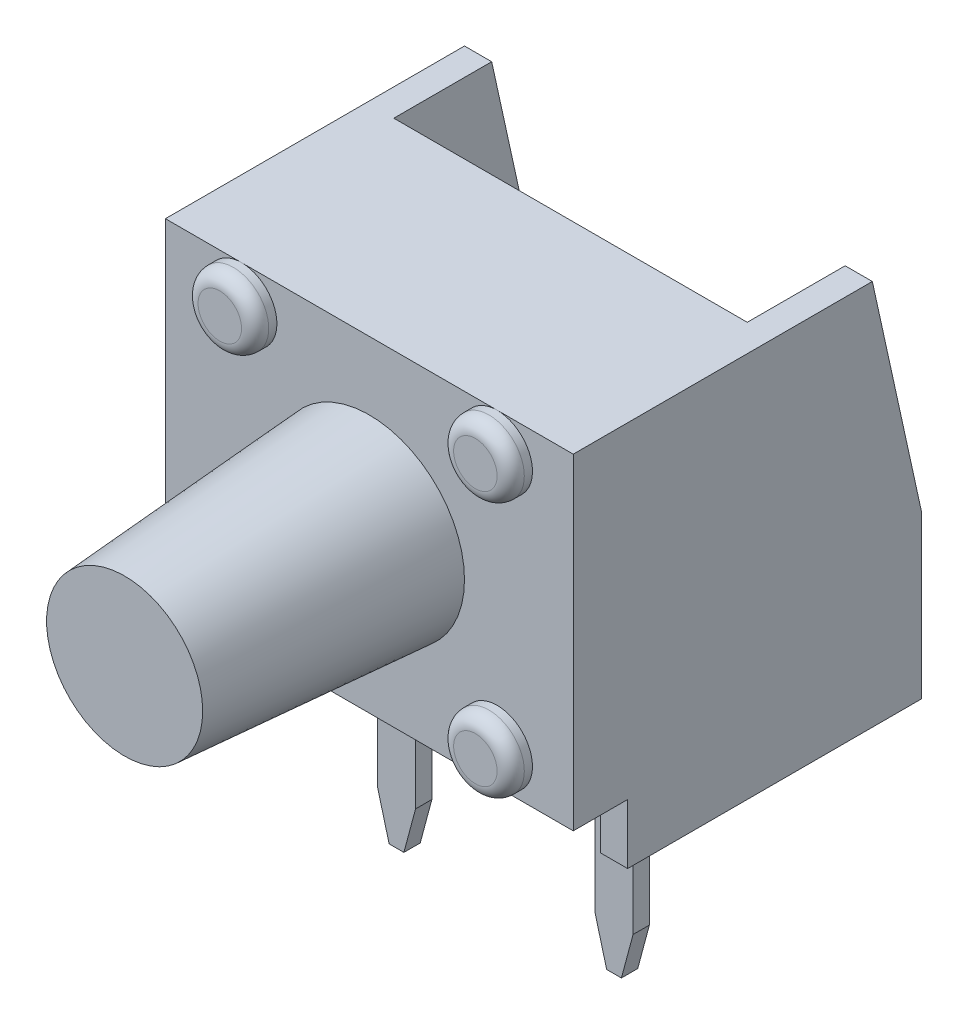
ISO-10303-21;
HEADER;
FILE_DESCRIPTION(('STEP AP214'),'2;1');
FILE_NAME('part.step','',(''),(''),'','','');
FILE_SCHEMA(('AUTOMOTIVE_DESIGN { 1 0 10303 214 1 1 1 1 }'));
ENDSEC;
DATA;
#1=APPLICATION_CONTEXT('core data for automotive mechanical design processes');
#2=APPLICATION_PROTOCOL_DEFINITION('international standard','automotive_design',2000,#1);
#3=PRODUCT_CONTEXT('',#1,'mechanical');
#4=PRODUCT('Part','Part','',(#3));
#5=PRODUCT_RELATED_PRODUCT_CATEGORY('part','',(#4));
#6=PRODUCT_DEFINITION_FORMATION('','',#4);
#7=PRODUCT_DEFINITION_CONTEXT('part definition',#1,'design');
#8=PRODUCT_DEFINITION('design','',#6,#7);
#9=PRODUCT_DEFINITION_SHAPE('','',#8);
#10=(LENGTH_UNIT() NAMED_UNIT(*) SI_UNIT(.MILLI.,.METRE.));
#11=(NAMED_UNIT(*) PLANE_ANGLE_UNIT() SI_UNIT($,.RADIAN.));
#12=(NAMED_UNIT(*) SI_UNIT($,.STERADIAN.) SOLID_ANGLE_UNIT());
#13=UNCERTAINTY_MEASURE_WITH_UNIT(LENGTH_MEASURE(1.E-05),#10,'distance_accuracy_value','');
#14=(GEOMETRIC_REPRESENTATION_CONTEXT(3) GLOBAL_UNCERTAINTY_ASSIGNED_CONTEXT((#13)) GLOBAL_UNIT_ASSIGNED_CONTEXT((#10,
#11,#12)) REPRESENTATION_CONTEXT('',''));
#15=CARTESIAN_POINT('',(0.,0.,0.));
#16=DIRECTION('',(0.,0.,1.));
#17=DIRECTION('',(1.,0.,0.));
#18=AXIS2_PLACEMENT_3D('',#15,#16,#17);
#19=CARTESIAN_POINT('',(0.,6.,-3.7));
#20=DIRECTION('',(0.,0.,1.));
#21=DIRECTION('',(1.,0.,0.));
#22=AXIS2_PLACEMENT_3D('',#19,#20,#21);
#23=PLANE('',#22);
#24=DIRECTION('',(0.,-1.,0.));
#25=VECTOR('',#24,1.);
#26=CARTESIAN_POINT('',(0.5,-1.1,-3.7));
#27=LINE('',#26,#25);
#28=CARTESIAN_POINT('',(0.5,6.,-3.7));
#29=VERTEX_POINT('',#28);
#30=CARTESIAN_POINT('',(0.5,0.,-3.7));
#31=VERTEX_POINT('',#30);
#32=EDGE_CURVE('E398',#29,#31,#27,.T.);
#33=ORIENTED_EDGE('',*,*,#32,.F.);
#34=DIRECTION('',(-1.,0.,0.));
#35=VECTOR('',#34,1.);
#36=CARTESIAN_POINT('',(0.,6.,-3.7));
#37=LINE('',#36,#35);
#38=CARTESIAN_POINT('',(7.,6.,-3.7));
#39=VERTEX_POINT('',#38);
#40=EDGE_CURVE('E255',#39,#29,#37,.T.);
#41=ORIENTED_EDGE('',*,*,#40,.F.);
#42=DIRECTION('',(0.,1.,0.));
#43=VECTOR('',#42,1.);
#44=CARTESIAN_POINT('',(7.,0.,-3.7));
#45=LINE('',#44,#43);
#46=CARTESIAN_POINT('',(7.,0.,-3.7));
#47=VERTEX_POINT('',#46);
#48=EDGE_CURVE('E262',#47,#39,#45,.T.);
#49=ORIENTED_EDGE('',*,*,#48,.F.);
#50=DIRECTION('',(-1.,0.,0.));
#51=VECTOR('',#50,1.);
#52=CARTESIAN_POINT('',(0.,0.,-3.7));
#53=LINE('',#52,#51);
#54=EDGE_CURVE('E248',#47,#31,#53,.T.);
#55=ORIENTED_EDGE('',*,*,#54,.T.);
#56=EDGE_LOOP('',(#33,#41,#49,#55));
#57=FACE_BOUND('',#56,.T.);
#58=ADVANCED_FACE('F37',(#57),#23,.F.);
#59=CARTESIAN_POINT('',(0.,0.,0.));
#60=DIRECTION('',(0.,-1.,0.));
#61=DIRECTION('',(0.,0.,-1.));
#62=AXIS2_PLACEMENT_3D('',#59,#60,#61);
#63=PLANE('',#62);
#64=DIRECTION('',(1.,0.,0.));
#65=VECTOR('',#64,1.);
#66=CARTESIAN_POINT('',(1.4,0.,-2.8));
#67=LINE('',#66,#65);
#68=CARTESIAN_POINT('',(1.4,0.,-2.8));
#69=VERTEX_POINT('',#68);
#70=CARTESIAN_POINT('',(2.1,0.,-2.8));
#71=VERTEX_POINT('',#70);
#72=EDGE_CURVE('E357',#69,#71,#67,.T.);
#73=ORIENTED_EDGE('',*,*,#72,.F.);
#74=DIRECTION('',(0.,0.,-1.));
#75=VECTOR('',#74,1.);
#76=CARTESIAN_POINT('',(1.4,0.,-2.5));
#77=LINE('',#76,#75);
#78=CARTESIAN_POINT('',(1.4,0.,-2.5));
#79=VERTEX_POINT('',#78);
#80=EDGE_CURVE('E346',#79,#69,#77,.T.);
#81=ORIENTED_EDGE('',*,*,#80,.F.);
#82=DIRECTION('',(-1.,0.,0.));
#83=VECTOR('',#82,1.);
#84=CARTESIAN_POINT('',(1.4,0.,-2.5));
#85=LINE('',#84,#83);
#86=CARTESIAN_POINT('',(2.1,0.,-2.5));
#87=VERTEX_POINT('',#86);
#88=EDGE_CURVE('E351',#87,#79,#85,.T.);
#89=ORIENTED_EDGE('',*,*,#88,.F.);
#90=DIRECTION('',(0.,0.,1.));
#91=VECTOR('',#90,1.);
#92=CARTESIAN_POINT('',(2.1,0.,-2.5));
#93=LINE('',#92,#91);
#94=EDGE_CURVE('E360',#71,#87,#93,.T.);
#95=ORIENTED_EDGE('',*,*,#94,.F.);
#96=EDGE_LOOP('',(#73,#81,#89,#95));
#97=FACE_BOUND('',#96,.T.);
#98=DIRECTION('',(1.,0.,0.));
#99=VECTOR('',#98,1.);
#100=CARTESIAN_POINT('',(5.4,0.,-2.8));
#101=LINE('',#100,#99);
#102=CARTESIAN_POINT('',(5.4,0.,-2.8));
#103=VERTEX_POINT('',#102);
#104=CARTESIAN_POINT('',(6.1,0.,-2.8));
#105=VERTEX_POINT('',#104);
#106=EDGE_CURVE('E445',#103,#105,#101,.T.);
#107=ORIENTED_EDGE('',*,*,#106,.F.);
#108=DIRECTION('',(0.,0.,-1.));
#109=VECTOR('',#108,1.);
#110=CARTESIAN_POINT('',(5.4,0.,-2.8));
#111=LINE('',#110,#109);
#112=CARTESIAN_POINT('',(5.4,0.,-2.5));
#113=VERTEX_POINT('',#112);
#114=EDGE_CURVE('E440',#113,#103,#111,.T.);
#115=ORIENTED_EDGE('',*,*,#114,.F.);
#116=DIRECTION('',(-1.,0.,0.));
#117=VECTOR('',#116,1.);
#118=CARTESIAN_POINT('',(5.4,0.,-2.5));
#119=LINE('',#118,#117);
#120=CARTESIAN_POINT('',(6.1,0.,-2.5));
#121=VERTEX_POINT('',#120);
#122=EDGE_CURVE('E326',#121,#113,#119,.T.);
#123=ORIENTED_EDGE('',*,*,#122,.F.);
#124=DIRECTION('',(0.,0.,1.));
#125=VECTOR('',#124,1.);
#126=CARTESIAN_POINT('',(6.1,0.,-2.8));
#127=LINE('',#126,#125);
#128=EDGE_CURVE('E336',#105,#121,#127,.T.);
#129=ORIENTED_EDGE('',*,*,#128,.F.);
#130=EDGE_LOOP('',(#107,#115,#123,#129));
#131=FACE_BOUND('',#130,.T.);
#132=DIRECTION('',(0.,0.,-1.));
#133=VECTOR('',#132,1.);
#134=CARTESIAN_POINT('',(7.,0.,-3.7));
#135=LINE('',#134,#133);
#136=CARTESIAN_POINT('',(7.,0.,-1.));
#137=VERTEX_POINT('',#136);
#138=EDGE_CURVE('E403',#137,#47,#135,.T.);
#139=ORIENTED_EDGE('',*,*,#138,.F.);
#140=DIRECTION('',(-1.,0.,0.));
#141=VECTOR('',#140,1.);
#142=CARTESIAN_POINT('',(7.5,0.,-1.));
#143=LINE('',#142,#141);
#144=CARTESIAN_POINT('',(7.5,0.,-1.));
#145=VERTEX_POINT('',#144);
#146=EDGE_CURVE('E411',#145,#137,#143,.T.);
#147=ORIENTED_EDGE('',*,*,#146,.F.);
#148=DIRECTION('',(0.,0.,-1.));
#149=VECTOR('',#148,1.);
#150=CARTESIAN_POINT('',(7.5,0.,0.));
#151=LINE('',#150,#149);
#152=CARTESIAN_POINT('',(7.5,0.,0.));
#153=VERTEX_POINT('',#152);
#154=EDGE_CURVE('E233',#153,#145,#151,.T.);
#155=ORIENTED_EDGE('',*,*,#154,.F.);
#156=DIRECTION('',(1.,0.,0.));
#157=VECTOR('',#156,1.);
#158=CARTESIAN_POINT('',(0.,0.,0.));
#159=LINE('',#158,#157);
#160=CARTESIAN_POINT('',(6.1,0.,0.));
#161=VERTEX_POINT('',#160);
#162=EDGE_CURVE('E236',#161,#153,#159,.T.);
#163=ORIENTED_EDGE('',*,*,#162,.F.);
#164=CARTESIAN_POINT('',(1.4,0.,0.));
#165=VERTEX_POINT('',#164);
#166=EDGE_CURVE('E234',#165,#161,#159,.T.);
#167=ORIENTED_EDGE('',*,*,#166,.F.);
#168=CARTESIAN_POINT('',(0.,0.,0.));
#169=VERTEX_POINT('',#168);
#170=EDGE_CURVE('E223',#169,#165,#159,.T.);
#171=ORIENTED_EDGE('',*,*,#170,.F.);
#172=DIRECTION('',(0.,0.,1.));
#173=VECTOR('',#172,1.);
#174=CARTESIAN_POINT('',(0.,0.,0.));
#175=LINE('',#174,#173);
#176=CARTESIAN_POINT('',(0.,0.,-1.));
#177=VERTEX_POINT('',#176);
#178=EDGE_CURVE('E242',#177,#169,#175,.T.);
#179=ORIENTED_EDGE('',*,*,#178,.F.);
#180=DIRECTION('',(-1.,0.,0.));
#181=VECTOR('',#180,1.);
#182=CARTESIAN_POINT('',(0.,0.,-1.));
#183=LINE('',#182,#181);
#184=CARTESIAN_POINT('',(0.5,0.,-1.));
#185=VERTEX_POINT('',#184);
#186=EDGE_CURVE('E429',#185,#177,#183,.T.);
#187=ORIENTED_EDGE('',*,*,#186,.F.);
#188=DIRECTION('',(0.,0.,1.));
#189=VECTOR('',#188,1.);
#190=CARTESIAN_POINT('',(0.5,0.,-1.));
#191=LINE('',#190,#189);
#192=EDGE_CURVE('E425',#31,#185,#191,.T.);
#193=ORIENTED_EDGE('',*,*,#192,.F.);
#194=ORIENTED_EDGE('',*,*,#54,.F.);
#195=EDGE_LOOP('',(#139,#147,#155,#163,#167,#171,#179,#187,#193,#194));
#196=FACE_BOUND('',#195,.T.);
#197=ADVANCED_FACE('F239',(#97,#131,#196),#63,.T.);
#198=CARTESIAN_POINT('',(0.,6.,0.));
#199=DIRECTION('',(1.,0.,0.));
#200=DIRECTION('',(0.,0.,-1.));
#201=AXIS2_PLACEMENT_3D('',#198,#199,#200);
#202=PLANE('',#201);
#203=DIRECTION('',(0.,0.,1.));
#204=VECTOR('',#203,1.);
#205=CARTESIAN_POINT('',(0.,6.,0.));
#206=LINE('',#205,#204);
#207=CARTESIAN_POINT('',(0.,6.,-5.5));
#208=VERTEX_POINT('',#207);
#209=CARTESIAN_POINT('',(0.,6.,0.));
#210=VERTEX_POINT('',#209);
#211=EDGE_CURVE('E251',#208,#210,#206,.T.);
#212=ORIENTED_EDGE('',*,*,#211,.F.);
#213=DIRECTION('',(0.,-0.976744343171884,-0.214407294842609));
#214=VECTOR('',#213,1.);
#215=CARTESIAN_POINT('',(0.,6.,-5.5));
#216=LINE('',#215,#214);
#217=CARTESIAN_POINT('',(0.,1.9,-6.4));
#218=VERTEX_POINT('',#217);
#219=EDGE_CURVE('E971',#208,#218,#216,.T.);
#220=ORIENTED_EDGE('',*,*,#219,.T.);
#221=DIRECTION('',(0.,1.,0.));
#222=VECTOR('',#221,1.);
#223=CARTESIAN_POINT('',(0.,6.,-6.4));
#224=LINE('',#223,#222);
#225=CARTESIAN_POINT('',(0.,-1.1,-6.4));
#226=VERTEX_POINT('',#225);
#227=EDGE_CURVE('E938',#226,#218,#224,.T.);
#228=ORIENTED_EDGE('',*,*,#227,.F.);
#229=DIRECTION('',(0.,0.,-1.));
#230=VECTOR('',#229,1.);
#231=CARTESIAN_POINT('',(0.,-1.1,-3.7));
#232=LINE('',#231,#230);
#233=CARTESIAN_POINT('',(0.,-1.1,-1.));
#234=VERTEX_POINT('',#233);
#235=EDGE_CURVE('E431',#234,#226,#232,.T.);
#236=ORIENTED_EDGE('',*,*,#235,.F.);
#237=DIRECTION('',(0.,1.,0.));
#238=VECTOR('',#237,1.);
#239=CARTESIAN_POINT('',(0.,-1.1,-1.));
#240=LINE('',#239,#238);
#241=EDGE_CURVE('E433',#234,#177,#240,.T.);
#242=ORIENTED_EDGE('',*,*,#241,.T.);
#243=ORIENTED_EDGE('',*,*,#178,.T.);
#244=DIRECTION('',(0.,-1.,0.));
#245=VECTOR('',#244,1.);
#246=CARTESIAN_POINT('',(0.,6.,0.));
#247=LINE('',#246,#245);
#248=EDGE_CURVE('E230',#210,#169,#247,.T.);
#249=ORIENTED_EDGE('',*,*,#248,.F.);
#250=EDGE_LOOP('',(#212,#220,#228,#236,#242,#243,#249));
#251=FACE_BOUND('',#250,.T.);
#252=ADVANCED_FACE('F468',(#251),#202,.F.);
#253=CARTESIAN_POINT('',(0.,6.,0.));
#254=DIRECTION('',(0.,0.,-1.));
#255=DIRECTION('',(-1.,0.,0.));
#256=AXIS2_PLACEMENT_3D('',#253,#254,#255);
#257=PLANE('',#256);
#258=CARTESIAN_POINT('',(3.75,3.,0.));
#259=DIRECTION('',(0.,0.,1.));
#260=DIRECTION('',(1.,0.,0.));
#261=AXIS2_PLACEMENT_3D('',#258,#259,#260);
#262=CIRCLE('',#261,1.75);
#263=CARTESIAN_POINT('',(5.5,3.,0.));
#264=VERTEX_POINT('',#263);
#265=EDGE_CURVE('E257',#264,#264,#262,.T.);
#266=ORIENTED_EDGE('',*,*,#265,.F.);
#267=EDGE_LOOP('',(#266));
#268=FACE_BOUND('',#267,.T.);
#269=ORIENTED_EDGE('',*,*,#170,.T.);
#270=CARTESIAN_POINT('',(1.4,0.65,0.));
#271=DIRECTION('',(0.,0.,1.));
#272=DIRECTION('',(1.,0.,0.));
#273=AXIS2_PLACEMENT_3D('',#270,#271,#272);
#274=CIRCLE('',#273,0.65);
#275=EDGE_CURVE('E227',#165,#165,#274,.T.);
#276=ORIENTED_EDGE('',*,*,#275,.F.);
#277=ORIENTED_EDGE('',*,*,#166,.T.);
#278=CARTESIAN_POINT('',(6.1,0.65,0.));
#279=DIRECTION('',(0.,0.,1.));
#280=DIRECTION('',(1.,0.,0.));
#281=AXIS2_PLACEMENT_3D('',#278,#279,#280);
#282=CIRCLE('',#281,0.65);
#283=EDGE_CURVE('E983',#161,#161,#282,.T.);
#284=ORIENTED_EDGE('',*,*,#283,.F.);
#285=ORIENTED_EDGE('',*,*,#162,.T.);
#286=DIRECTION('',(0.,-1.,0.));
#287=VECTOR('',#286,1.);
#288=CARTESIAN_POINT('',(7.5,6.,0.));
#289=LINE('',#288,#287);
#290=CARTESIAN_POINT('',(7.5,6.,0.));
#291=VERTEX_POINT('',#290);
#292=EDGE_CURVE('E252',#291,#153,#289,.T.);
#293=ORIENTED_EDGE('',*,*,#292,.F.);
#294=DIRECTION('',(1.,0.,0.));
#295=VECTOR('',#294,1.);
#296=CARTESIAN_POINT('',(0.,6.,0.));
#297=LINE('',#296,#295);
#298=CARTESIAN_POINT('',(6.1,6.,0.));
#299=VERTEX_POINT('',#298);
#300=EDGE_CURVE('E378',#299,#291,#297,.T.);
#301=ORIENTED_EDGE('',*,*,#300,.F.);
#302=CARTESIAN_POINT('',(6.1,5.35,0.));
#303=DIRECTION('',(0.,0.,1.));
#304=DIRECTION('',(1.,0.,0.));
#305=AXIS2_PLACEMENT_3D('',#302,#303,#304);
#306=CIRCLE('',#305,0.65);
#307=EDGE_CURVE('E980',#299,#299,#306,.T.);
#308=ORIENTED_EDGE('',*,*,#307,.F.);
#309=CARTESIAN_POINT('',(1.4,6.,0.));
#310=VERTEX_POINT('',#309);
#311=EDGE_CURVE('E382',#310,#299,#297,.T.);
#312=ORIENTED_EDGE('',*,*,#311,.F.);
#313=CARTESIAN_POINT('',(1.4,5.35,0.));
#314=DIRECTION('',(0.,0.,1.));
#315=DIRECTION('',(1.,0.,0.));
#316=AXIS2_PLACEMENT_3D('',#313,#314,#315);
#317=CIRCLE('',#316,0.65);
#318=EDGE_CURVE('E975',#310,#310,#317,.T.);
#319=ORIENTED_EDGE('',*,*,#318,.F.);
#320=EDGE_CURVE('E379',#210,#310,#297,.T.);
#321=ORIENTED_EDGE('',*,*,#320,.F.);
#322=ORIENTED_EDGE('',*,*,#248,.T.);
#323=EDGE_LOOP('',(#269,#276,#277,#284,#285,#293,#301,#308,#312,#319,#321,#322));
#324=FACE_BOUND('',#323,.T.);
#325=ADVANCED_FACE('F225',(#268,#324),#257,.F.);
#326=CARTESIAN_POINT('',(7.5,6.,0.));
#327=DIRECTION('',(-1.,0.,0.));
#328=DIRECTION('',(0.,0.,1.));
#329=AXIS2_PLACEMENT_3D('',#326,#327,#328);
#330=PLANE('',#329);
#331=DIRECTION('',(0.,-1.,0.));
#332=VECTOR('',#331,1.);
#333=CARTESIAN_POINT('',(7.5,6.,-6.4));
#334=LINE('',#333,#332);
#335=CARTESIAN_POINT('',(7.5,1.9,-6.4));
#336=VERTEX_POINT('',#335);
#337=CARTESIAN_POINT('',(7.5,-1.1,-6.4));
#338=VERTEX_POINT('',#337);
#339=EDGE_CURVE('E949',#336,#338,#334,.T.);
#340=ORIENTED_EDGE('',*,*,#339,.F.);
#341=DIRECTION('',(0.,-0.976744343171884,-0.214407294842609));
#342=VECTOR('',#341,1.);
#343=CARTESIAN_POINT('',(7.5,6.,-5.5));
#344=LINE('',#343,#342);
#345=CARTESIAN_POINT('',(7.5,6.,-5.5));
#346=VERTEX_POINT('',#345);
#347=EDGE_CURVE('E973',#346,#336,#344,.T.);
#348=ORIENTED_EDGE('',*,*,#347,.F.);
#349=DIRECTION('',(0.,0.,-1.));
#350=VECTOR('',#349,1.);
#351=CARTESIAN_POINT('',(7.5,6.,0.));
#352=LINE('',#351,#350);
#353=EDGE_CURVE('E381',#291,#346,#352,.T.);
#354=ORIENTED_EDGE('',*,*,#353,.F.);
#355=ORIENTED_EDGE('',*,*,#292,.T.);
#356=ORIENTED_EDGE('',*,*,#154,.T.);
#357=DIRECTION('',(0.,1.,0.));
#358=VECTOR('',#357,1.);
#359=CARTESIAN_POINT('',(7.5,-1.1,-1.));
#360=LINE('',#359,#358);
#361=CARTESIAN_POINT('',(7.5,-1.1,-1.));
#362=VERTEX_POINT('',#361);
#363=EDGE_CURVE('E423',#362,#145,#360,.T.);
#364=ORIENTED_EDGE('',*,*,#363,.F.);
#365=DIRECTION('',(0.,0.,1.));
#366=VECTOR('',#365,1.);
#367=CARTESIAN_POINT('',(7.5,-1.1,-3.7));
#368=LINE('',#367,#366);
#369=EDGE_CURVE('E412',#338,#362,#368,.T.);
#370=ORIENTED_EDGE('',*,*,#369,.F.);
#371=EDGE_LOOP('',(#340,#348,#354,#355,#356,#364,#370));
#372=FACE_BOUND('',#371,.T.);
#373=ADVANCED_FACE('F473',(#372),#330,.F.);
#374=CARTESIAN_POINT('',(0.,6.,0.));
#375=DIRECTION('',(0.,-1.,0.));
#376=DIRECTION('',(0.,0.,-1.));
#377=AXIS2_PLACEMENT_3D('',#374,#375,#376);
#378=PLANE('',#377);
#379=ORIENTED_EDGE('',*,*,#353,.T.);
#380=DIRECTION('',(1.,0.,0.));
#381=VECTOR('',#380,1.);
#382=CARTESIAN_POINT('',(0.,6.,-5.5));
#383=LINE('',#382,#381);
#384=CARTESIAN_POINT('',(7.,6.,-5.5));
#385=VERTEX_POINT('',#384);
#386=EDGE_CURVE('E972',#385,#346,#383,.T.);
#387=ORIENTED_EDGE('',*,*,#386,.F.);
#388=DIRECTION('',(0.,0.,1.));
#389=VECTOR('',#388,1.);
#390=CARTESIAN_POINT('',(7.,6.,-6.4));
#391=LINE('',#390,#389);
#392=EDGE_CURVE('E393',#385,#39,#391,.T.);
#393=ORIENTED_EDGE('',*,*,#392,.T.);
#394=ORIENTED_EDGE('',*,*,#40,.T.);
#395=DIRECTION('',(0.,0.,1.));
#396=VECTOR('',#395,1.);
#397=CARTESIAN_POINT('',(0.5,6.,-6.4));
#398=LINE('',#397,#396);
#399=CARTESIAN_POINT('',(0.5,6.,-5.5));
#400=VERTEX_POINT('',#399);
#401=EDGE_CURVE('E390',#400,#29,#398,.T.);
#402=ORIENTED_EDGE('',*,*,#401,.F.);
#403=EDGE_CURVE('E964',#208,#400,#383,.T.);
#404=ORIENTED_EDGE('',*,*,#403,.F.);
#405=ORIENTED_EDGE('',*,*,#211,.T.);
#406=ORIENTED_EDGE('',*,*,#320,.T.);
#407=ORIENTED_EDGE('',*,*,#311,.T.);
#408=ORIENTED_EDGE('',*,*,#300,.T.);
#409=EDGE_LOOP('',(#379,#387,#393,#394,#402,#404,#405,#406,#407,#408));
#410=FACE_BOUND('',#409,.T.);
#411=ADVANCED_FACE('F388',(#410),#378,.F.);
#412=CARTESIAN_POINT('',(3.75,3.,0.));
#413=DIRECTION('',(0.,0.,-1.));
#414=DIRECTION('',(1.,0.,0.));
#415=AXIS2_PLACEMENT_3D('',#412,#413,#414);
#416=CONICAL_SURFACE('',#415,1.75,0.0698131700797733);
#417=CARTESIAN_POINT('',(3.75,3.,4.5));
#418=DIRECTION('',(0.,0.,1.));
#419=DIRECTION('',(1.,0.,0.));
#420=AXIS2_PLACEMENT_3D('',#417,#418,#419);
#421=CIRCLE('',#420,1.4353293462542);
#422=CARTESIAN_POINT('',(5.1853293462542,3.,4.5));
#423=VERTEX_POINT('',#422);
#424=EDGE_CURVE('E372',#423,#423,#421,.T.);
#425=ORIENTED_EDGE('',*,*,#424,.F.);
#426=EDGE_LOOP('',(#425));
#427=FACE_BOUND('',#426,.T.);
#428=ORIENTED_EDGE('',*,*,#265,.T.);
#429=EDGE_LOOP('',(#428));
#430=FACE_BOUND('',#429,.T.);
#431=ADVANCED_FACE('F550',(#427,#430),#416,.T.);
#432=CARTESIAN_POINT('',(3.75,3.,4.5));
#433=DIRECTION('',(0.,0.,1.));
#434=DIRECTION('',(1.,0.,0.));
#435=AXIS2_PLACEMENT_3D('',#432,#433,#434);
#436=PLANE('',#435);
#437=ORIENTED_EDGE('',*,*,#424,.T.);
#438=EDGE_LOOP('',(#437));
#439=FACE_BOUND('',#438,.T.);
#440=ADVANCED_FACE('F547',(#439),#436,.T.);
#441=CARTESIAN_POINT('',(1.4,-4.4,-2.5));
#442=DIRECTION('',(1.,0.,0.));
#443=DIRECTION('',(0.,0.,-1.));
#444=AXIS2_PLACEMENT_3D('',#441,#442,#443);
#445=PLANE('',#444);
#446=DIRECTION('',(0.,1.,0.));
#447=VECTOR('',#446,1.);
#448=CARTESIAN_POINT('',(1.4,-4.4,-2.8));
#449=LINE('',#448,#447);
#450=CARTESIAN_POINT('',(1.4,-3.59999999999999,-2.8));
#451=VERTEX_POINT('',#450);
#452=EDGE_CURVE('E370',#451,#69,#449,.T.);
#453=ORIENTED_EDGE('',*,*,#452,.F.);
#454=DIRECTION('',(0.,0.,1.));
#455=VECTOR('',#454,1.);
#456=CARTESIAN_POINT('',(1.4,-3.59999999999999,-2.5));
#457=LINE('',#456,#455);
#458=CARTESIAN_POINT('',(1.4,-3.59999999999999,-2.5));
#459=VERTEX_POINT('',#458);
#460=EDGE_CURVE('E293',#451,#459,#457,.T.);
#461=ORIENTED_EDGE('',*,*,#460,.T.);
#462=DIRECTION('',(0.,1.,0.));
#463=VECTOR('',#462,1.);
#464=CARTESIAN_POINT('',(1.4,-4.4,-2.5));
#465=LINE('',#464,#463);
#466=EDGE_CURVE('E354',#459,#79,#465,.T.);
#467=ORIENTED_EDGE('',*,*,#466,.T.);
#468=ORIENTED_EDGE('',*,*,#80,.T.);
#469=EDGE_LOOP('',(#453,#461,#467,#468));
#470=FACE_BOUND('',#469,.T.);
#471=ADVANCED_FACE('F522',(#470),#445,.F.);
#472=CARTESIAN_POINT('',(1.4,-4.4,-2.8));
#473=DIRECTION('',(0.,0.,1.));
#474=DIRECTION('',(1.,0.,0.));
#475=AXIS2_PLACEMENT_3D('',#472,#473,#474);
#476=PLANE('',#475);
#477=DIRECTION('',(1.,0.,0.));
#478=VECTOR('',#477,1.);
#479=CARTESIAN_POINT('',(1.4,-4.4,-2.8));
#480=LINE('',#479,#478);
#481=CARTESIAN_POINT('',(1.6143593539449,-4.4,-2.8));
#482=VERTEX_POINT('',#481);
#483=CARTESIAN_POINT('',(1.8856406460551,-4.4,-2.8));
#484=VERTEX_POINT('',#483);
#485=EDGE_CURVE('E347',#482,#484,#480,.T.);
#486=ORIENTED_EDGE('',*,*,#485,.F.);
#487=DIRECTION('',(-0.258819045102518,0.965925826289069,0.));
#488=VECTOR('',#487,1.);
#489=CARTESIAN_POINT('',(1.6143593539449,-4.4,-2.8));
#490=LINE('',#489,#488);
#491=EDGE_CURVE('E291',#482,#451,#490,.T.);
#492=ORIENTED_EDGE('',*,*,#491,.T.);
#493=ORIENTED_EDGE('',*,*,#452,.T.);
#494=ORIENTED_EDGE('',*,*,#72,.T.);
#495=DIRECTION('',(0.,1.,0.));
#496=VECTOR('',#495,1.);
#497=CARTESIAN_POINT('',(2.1,-4.4,-2.8));
#498=LINE('',#497,#496);
#499=CARTESIAN_POINT('',(2.1,-3.59999999999999,-2.8));
#500=VERTEX_POINT('',#499);
#501=EDGE_CURVE('E368',#500,#71,#498,.T.);
#502=ORIENTED_EDGE('',*,*,#501,.F.);
#503=DIRECTION('',(-0.258819045102518,-0.965925826289069,0.));
#504=VECTOR('',#503,1.);
#505=CARTESIAN_POINT('',(1.8856406460551,-4.4,-2.8));
#506=LINE('',#505,#504);
#507=EDGE_CURVE('E289',#500,#484,#506,.T.);
#508=ORIENTED_EDGE('',*,*,#507,.T.);
#509=EDGE_LOOP('',(#486,#492,#493,#494,#502,#508));
#510=FACE_BOUND('',#509,.T.);
#511=ADVANCED_FACE('F513',(#510),#476,.F.);
#512=CARTESIAN_POINT('',(2.1,-4.4,-2.5));
#513=DIRECTION('',(-1.,0.,0.));
#514=DIRECTION('',(0.,0.,1.));
#515=AXIS2_PLACEMENT_3D('',#512,#513,#514);
#516=PLANE('',#515);
#517=DIRECTION('',(0.,1.,0.));
#518=VECTOR('',#517,1.);
#519=CARTESIAN_POINT('',(2.1,-4.4,-2.5));
#520=LINE('',#519,#518);
#521=CARTESIAN_POINT('',(2.1,-3.59999999999999,-2.5));
#522=VERTEX_POINT('',#521);
#523=EDGE_CURVE('E366',#522,#87,#520,.T.);
#524=ORIENTED_EDGE('',*,*,#523,.F.);
#525=DIRECTION('',(0.,0.,-1.));
#526=VECTOR('',#525,1.);
#527=CARTESIAN_POINT('',(2.1,-3.59999999999999,-2.8));
#528=LINE('',#527,#526);
#529=EDGE_CURVE('E299',#522,#500,#528,.T.);
#530=ORIENTED_EDGE('',*,*,#529,.T.);
#531=ORIENTED_EDGE('',*,*,#501,.T.);
#532=ORIENTED_EDGE('',*,*,#94,.T.);
#533=EDGE_LOOP('',(#524,#530,#531,#532));
#534=FACE_BOUND('',#533,.T.);
#535=ADVANCED_FACE('F530',(#534),#516,.F.);
#536=CARTESIAN_POINT('',(1.4,-4.4,-2.5));
#537=DIRECTION('',(0.,0.,-1.));
#538=DIRECTION('',(-1.,0.,0.));
#539=AXIS2_PLACEMENT_3D('',#536,#537,#538);
#540=PLANE('',#539);
#541=ORIENTED_EDGE('',*,*,#466,.F.);
#542=DIRECTION('',(0.258819045102518,-0.965925826289069,0.));
#543=VECTOR('',#542,1.);
#544=CARTESIAN_POINT('',(1.6143593539449,-4.4,-2.5));
#545=LINE('',#544,#543);
#546=CARTESIAN_POINT('',(1.6143593539449,-4.4,-2.5));
#547=VERTEX_POINT('',#546);
#548=EDGE_CURVE('E297',#459,#547,#545,.T.);
#549=ORIENTED_EDGE('',*,*,#548,.T.);
#550=DIRECTION('',(-1.,0.,0.));
#551=VECTOR('',#550,1.);
#552=CARTESIAN_POINT('',(1.4,-4.4,-2.5));
#553=LINE('',#552,#551);
#554=CARTESIAN_POINT('',(1.8856406460551,-4.4,-2.5));
#555=VERTEX_POINT('',#554);
#556=EDGE_CURVE('E350',#555,#547,#553,.T.);
#557=ORIENTED_EDGE('',*,*,#556,.F.);
#558=DIRECTION('',(0.258819045102518,0.965925826289069,0.));
#559=VECTOR('',#558,1.);
#560=CARTESIAN_POINT('',(1.8856406460551,-4.4,-2.5));
#561=LINE('',#560,#559);
#562=EDGE_CURVE('E295',#555,#522,#561,.T.);
#563=ORIENTED_EDGE('',*,*,#562,.T.);
#564=ORIENTED_EDGE('',*,*,#523,.T.);
#565=ORIENTED_EDGE('',*,*,#88,.T.);
#566=EDGE_LOOP('',(#541,#549,#557,#563,#564,#565));
#567=FACE_BOUND('',#566,.T.);
#568=ADVANCED_FACE('F532',(#567),#540,.F.);
#569=CARTESIAN_POINT('',(0.,-4.4,0.));
#570=DIRECTION('',(0.,-1.,0.));
#571=DIRECTION('',(0.,0.,-1.));
#572=AXIS2_PLACEMENT_3D('',#569,#570,#571);
#573=PLANE('',#572);
#574=ORIENTED_EDGE('',*,*,#556,.T.);
#575=DIRECTION('',(0.,0.,-1.));
#576=VECTOR('',#575,1.);
#577=CARTESIAN_POINT('',(1.6143593539449,-4.4,-2.8));
#578=LINE('',#577,#576);
#579=EDGE_CURVE('E286',#547,#482,#578,.T.);
#580=ORIENTED_EDGE('',*,*,#579,.T.);
#581=ORIENTED_EDGE('',*,*,#485,.T.);
#582=DIRECTION('',(0.,0.,1.));
#583=VECTOR('',#582,1.);
#584=CARTESIAN_POINT('',(1.8856406460551,-4.4,-2.5));
#585=LINE('',#584,#583);
#586=EDGE_CURVE('E283',#484,#555,#585,.T.);
#587=ORIENTED_EDGE('',*,*,#586,.T.);
#588=EDGE_LOOP('',(#574,#580,#581,#587));
#589=FACE_BOUND('',#588,.T.);
#590=ADVANCED_FACE('F515',(#589),#573,.T.);
#591=CARTESIAN_POINT('',(5.4,-4.4,-2.8));
#592=DIRECTION('',(1.,0.,0.));
#593=DIRECTION('',(0.,0.,-1.));
#594=AXIS2_PLACEMENT_3D('',#591,#592,#593);
#595=PLANE('',#594);
#596=DIRECTION('',(0.,1.,0.));
#597=VECTOR('',#596,1.);
#598=CARTESIAN_POINT('',(5.4,-4.4,-2.8));
#599=LINE('',#598,#597);
#600=CARTESIAN_POINT('',(5.4,-3.59999999999999,-2.8));
#601=VERTEX_POINT('',#600);
#602=EDGE_CURVE('E340',#601,#103,#599,.T.);
#603=ORIENTED_EDGE('',*,*,#602,.F.);
#604=DIRECTION('',(0.,0.,1.));
#605=VECTOR('',#604,1.);
#606=CARTESIAN_POINT('',(5.4,-3.59999999999999,-2.8));
#607=LINE('',#606,#605);
#608=CARTESIAN_POINT('',(5.4,-3.59999999999999,-2.5));
#609=VERTEX_POINT('',#608);
#610=EDGE_CURVE('E11',#601,#609,#607,.T.);
#611=ORIENTED_EDGE('',*,*,#610,.T.);
#612=DIRECTION('',(0.,1.,0.));
#613=VECTOR('',#612,1.);
#614=CARTESIAN_POINT('',(5.4,-4.4,-2.5));
#615=LINE('',#614,#613);
#616=EDGE_CURVE('E338',#609,#113,#615,.T.);
#617=ORIENTED_EDGE('',*,*,#616,.T.);
#618=ORIENTED_EDGE('',*,*,#114,.T.);
#619=EDGE_LOOP('',(#603,#611,#617,#618));
#620=FACE_BOUND('',#619,.T.);
#621=ADVANCED_FACE('F453',(#620),#595,.F.);
#622=CARTESIAN_POINT('',(5.4,-4.4,-2.8));
#623=DIRECTION('',(0.,0.,1.));
#624=DIRECTION('',(1.,0.,0.));
#625=AXIS2_PLACEMENT_3D('',#622,#623,#624);
#626=PLANE('',#625);
#627=DIRECTION('',(0.,1.,0.));
#628=VECTOR('',#627,1.);
#629=CARTESIAN_POINT('',(6.1,-4.4,-2.8));
#630=LINE('',#629,#628);
#631=CARTESIAN_POINT('',(6.1,-3.59999999999999,-2.8));
#632=VERTEX_POINT('',#631);
#633=EDGE_CURVE('E317',#632,#105,#630,.T.);
#634=ORIENTED_EDGE('',*,*,#633,.F.);
#635=DIRECTION('',(0.258819045102518,0.965925826289069,0.));
#636=VECTOR('',#635,1.);
#637=CARTESIAN_POINT('',(5.8856406460551,-4.4,-2.8));
#638=LINE('',#637,#636);
#639=CARTESIAN_POINT('',(5.8856406460551,-4.4,-2.8));
#640=VERTEX_POINT('',#639);
#641=EDGE_CURVE('E45',#632,#640,#638,.F.);
#642=ORIENTED_EDGE('',*,*,#641,.T.);
#643=DIRECTION('',(1.,0.,0.));
#644=VECTOR('',#643,1.);
#645=CARTESIAN_POINT('',(5.4,-4.4,-2.8));
#646=LINE('',#645,#644);
#647=CARTESIAN_POINT('',(5.6143593539449,-4.4,-2.8));
#648=VERTEX_POINT('',#647);
#649=EDGE_CURVE('E315',#648,#640,#646,.T.);
#650=ORIENTED_EDGE('',*,*,#649,.F.);
#651=DIRECTION('',(0.258819045102518,-0.965925826289069,0.));
#652=VECTOR('',#651,1.);
#653=CARTESIAN_POINT('',(5.6143593539449,-4.4,-2.8));
#654=LINE('',#653,#652);
#655=EDGE_CURVE('E52',#648,#601,#654,.F.);
#656=ORIENTED_EDGE('',*,*,#655,.T.);
#657=ORIENTED_EDGE('',*,*,#602,.T.);
#658=ORIENTED_EDGE('',*,*,#106,.T.);
#659=EDGE_LOOP('',(#634,#642,#650,#656,#657,#658));
#660=FACE_BOUND('',#659,.T.);
#661=ADVANCED_FACE('F314',(#660),#626,.F.);
#662=CARTESIAN_POINT('',(6.1,-4.4,-2.8));
#663=DIRECTION('',(-1.,0.,0.));
#664=DIRECTION('',(0.,0.,1.));
#665=AXIS2_PLACEMENT_3D('',#662,#663,#664);
#666=PLANE('',#665);
#667=DIRECTION('',(0.,1.,0.));
#668=VECTOR('',#667,1.);
#669=CARTESIAN_POINT('',(6.1,-4.4,-2.5));
#670=LINE('',#669,#668);
#671=CARTESIAN_POINT('',(6.1,-3.59999999999999,-2.5));
#672=VERTEX_POINT('',#671);
#673=EDGE_CURVE('E332',#672,#121,#670,.T.);
#674=ORIENTED_EDGE('',*,*,#673,.F.);
#675=DIRECTION('',(0.,0.,-1.));
#676=VECTOR('',#675,1.);
#677=CARTESIAN_POINT('',(6.1,-3.59999999999999,-2.8));
#678=LINE('',#677,#676);
#679=EDGE_CURVE('E60',#672,#632,#678,.T.);
#680=ORIENTED_EDGE('',*,*,#679,.T.);
#681=ORIENTED_EDGE('',*,*,#633,.T.);
#682=ORIENTED_EDGE('',*,*,#128,.T.);
#683=EDGE_LOOP('',(#674,#680,#681,#682));
#684=FACE_BOUND('',#683,.T.);
#685=ADVANCED_FACE('F334',(#684),#666,.F.);
#686=CARTESIAN_POINT('',(5.4,-4.4,-2.5));
#687=DIRECTION('',(0.,0.,-1.));
#688=DIRECTION('',(-1.,0.,0.));
#689=AXIS2_PLACEMENT_3D('',#686,#687,#688);
#690=PLANE('',#689);
#691=DIRECTION('',(-1.,0.,0.));
#692=VECTOR('',#691,1.);
#693=CARTESIAN_POINT('',(5.4,-4.4,-2.5));
#694=LINE('',#693,#692);
#695=CARTESIAN_POINT('',(5.8856406460551,-4.4,-2.5));
#696=VERTEX_POINT('',#695);
#697=CARTESIAN_POINT('',(5.6143593539449,-4.4,-2.5));
#698=VERTEX_POINT('',#697);
#699=EDGE_CURVE('E325',#696,#698,#694,.T.);
#700=ORIENTED_EDGE('',*,*,#699,.F.);
#701=DIRECTION('',(-0.258819045102518,-0.965925826289069,0.));
#702=VECTOR('',#701,1.);
#703=CARTESIAN_POINT('',(5.8856406460551,-4.4,-2.5));
#704=LINE('',#703,#702);
#705=EDGE_CURVE('E309',#696,#672,#704,.F.);
#706=ORIENTED_EDGE('',*,*,#705,.T.);
#707=ORIENTED_EDGE('',*,*,#673,.T.);
#708=ORIENTED_EDGE('',*,*,#122,.T.);
#709=ORIENTED_EDGE('',*,*,#616,.F.);
#710=DIRECTION('',(-0.258819045102518,0.965925826289069,0.));
#711=VECTOR('',#710,1.);
#712=CARTESIAN_POINT('',(5.6143593539449,-4.4,-2.5));
#713=LINE('',#712,#711);
#714=EDGE_CURVE('E307',#609,#698,#713,.F.);
#715=ORIENTED_EDGE('',*,*,#714,.T.);
#716=EDGE_LOOP('',(#700,#706,#707,#708,#709,#715));
#717=FACE_BOUND('',#716,.T.);
#718=ADVANCED_FACE('F330',(#717),#690,.F.);
#719=CARTESIAN_POINT('',(0.,-4.4,0.));
#720=DIRECTION('',(0.,1.,0.));
#721=DIRECTION('',(0.,0.,1.));
#722=AXIS2_PLACEMENT_3D('',#719,#720,#721);
#723=PLANE('',#722);
#724=ORIENTED_EDGE('',*,*,#649,.T.);
#725=DIRECTION('',(0.,0.,1.));
#726=VECTOR('',#725,1.);
#727=CARTESIAN_POINT('',(5.8856406460551,-4.4,0.));
#728=LINE('',#727,#726);
#729=EDGE_CURVE('E304',#640,#696,#728,.T.);
#730=ORIENTED_EDGE('',*,*,#729,.T.);
#731=ORIENTED_EDGE('',*,*,#699,.T.);
#732=DIRECTION('',(0.,0.,-1.));
#733=VECTOR('',#732,1.);
#734=CARTESIAN_POINT('',(5.6143593539449,-4.4,0.));
#735=LINE('',#734,#733);
#736=EDGE_CURVE('E301',#698,#648,#735,.T.);
#737=ORIENTED_EDGE('',*,*,#736,.T.);
#738=EDGE_LOOP('',(#724,#730,#731,#737));
#739=FACE_BOUND('',#738,.T.);
#740=ADVANCED_FACE('F321',(#739),#723,.F.);
#741=CARTESIAN_POINT('',(0.5,-1.1,-1.));
#742=DIRECTION('',(-1.,0.,0.));
#743=DIRECTION('',(0.,0.,1.));
#744=AXIS2_PLACEMENT_3D('',#741,#742,#743);
#745=PLANE('',#744);
#746=DIRECTION('',(0.,-1.,0.));
#747=VECTOR('',#746,1.);
#748=CARTESIAN_POINT('',(0.5,0.,-6.4));
#749=LINE('',#748,#747);
#750=CARTESIAN_POINT('',(0.5,1.9,-6.4));
#751=VERTEX_POINT('',#750);
#752=CARTESIAN_POINT('',(0.5,-1.1,-6.4));
#753=VERTEX_POINT('',#752);
#754=EDGE_CURVE('E932',#751,#753,#749,.T.);
#755=ORIENTED_EDGE('',*,*,#754,.F.);
#756=DIRECTION('',(0.,0.976744343171884,0.214407294842609));
#757=VECTOR('',#756,1.);
#758=CARTESIAN_POINT('',(0.5,0.168785471055619,-6.7800227014756));
#759=LINE('',#758,#757);
#760=EDGE_CURVE('E933',#751,#400,#759,.T.);
#761=ORIENTED_EDGE('',*,*,#760,.T.);
#762=ORIENTED_EDGE('',*,*,#401,.T.);
#763=ORIENTED_EDGE('',*,*,#32,.T.);
#764=ORIENTED_EDGE('',*,*,#192,.T.);
#765=DIRECTION('',(0.,1.,0.));
#766=VECTOR('',#765,1.);
#767=CARTESIAN_POINT('',(0.5,-1.1,-1.));
#768=LINE('',#767,#766);
#769=CARTESIAN_POINT('',(0.5,-1.1,-1.));
#770=VERTEX_POINT('',#769);
#771=EDGE_CURVE('E438',#770,#185,#768,.T.);
#772=ORIENTED_EDGE('',*,*,#771,.F.);
#773=DIRECTION('',(0.,0.,1.));
#774=VECTOR('',#773,1.);
#775=CARTESIAN_POINT('',(0.5,-1.1,-1.));
#776=LINE('',#775,#774);
#777=EDGE_CURVE('E426',#753,#770,#776,.T.);
#778=ORIENTED_EDGE('',*,*,#777,.F.);
#779=EDGE_LOOP('',(#755,#761,#762,#763,#764,#772,#778));
#780=FACE_BOUND('',#779,.T.);
#781=ADVANCED_FACE('F632',(#780),#745,.F.);
#782=CARTESIAN_POINT('',(0.,-1.1,-1.));
#783=DIRECTION('',(0.,0.,-1.));
#784=DIRECTION('',(-1.,0.,0.));
#785=AXIS2_PLACEMENT_3D('',#782,#783,#784);
#786=PLANE('',#785);
#787=ORIENTED_EDGE('',*,*,#186,.T.);
#788=ORIENTED_EDGE('',*,*,#241,.F.);
#789=DIRECTION('',(-1.,0.,0.));
#790=VECTOR('',#789,1.);
#791=CARTESIAN_POINT('',(0.,-1.1,-1.));
#792=LINE('',#791,#790);
#793=EDGE_CURVE('E428',#770,#234,#792,.T.);
#794=ORIENTED_EDGE('',*,*,#793,.F.);
#795=ORIENTED_EDGE('',*,*,#771,.T.);
#796=EDGE_LOOP('',(#787,#788,#794,#795));
#797=FACE_BOUND('',#796,.T.);
#798=ADVANCED_FACE('F795',(#797),#786,.F.);
#799=CARTESIAN_POINT('',(0.,-1.1,0.));
#800=DIRECTION('',(0.,1.,0.));
#801=DIRECTION('',(0.,0.,1.));
#802=AXIS2_PLACEMENT_3D('',#799,#800,#801);
#803=PLANE('',#802);
#804=ORIENTED_EDGE('',*,*,#235,.T.);
#805=DIRECTION('',(-1.,0.,0.));
#806=VECTOR('',#805,1.);
#807=CARTESIAN_POINT('',(0.,-1.1,-6.4));
#808=LINE('',#807,#806);
#809=EDGE_CURVE('E943',#753,#226,#808,.T.);
#810=ORIENTED_EDGE('',*,*,#809,.F.);
#811=ORIENTED_EDGE('',*,*,#777,.T.);
#812=ORIENTED_EDGE('',*,*,#793,.T.);
#813=EDGE_LOOP('',(#804,#810,#811,#812));
#814=FACE_BOUND('',#813,.T.);
#815=ADVANCED_FACE('F788',(#814),#803,.F.);
#816=CARTESIAN_POINT('',(7.5,-1.1,-1.));
#817=DIRECTION('',(0.,0.,-1.));
#818=DIRECTION('',(-1.,0.,0.));
#819=AXIS2_PLACEMENT_3D('',#816,#817,#818);
#820=PLANE('',#819);
#821=ORIENTED_EDGE('',*,*,#146,.T.);
#822=DIRECTION('',(0.,1.,0.));
#823=VECTOR('',#822,1.);
#824=CARTESIAN_POINT('',(7.,-1.1,-1.));
#825=LINE('',#824,#823);
#826=CARTESIAN_POINT('',(7.,-1.1,-1.));
#827=VERTEX_POINT('',#826);
#828=EDGE_CURVE('E419',#827,#137,#825,.T.);
#829=ORIENTED_EDGE('',*,*,#828,.F.);
#830=DIRECTION('',(-1.,0.,0.));
#831=VECTOR('',#830,1.);
#832=CARTESIAN_POINT('',(7.5,-1.1,-1.));
#833=LINE('',#832,#831);
#834=EDGE_CURVE('E415',#362,#827,#833,.T.);
#835=ORIENTED_EDGE('',*,*,#834,.F.);
#836=ORIENTED_EDGE('',*,*,#363,.T.);
#837=EDGE_LOOP('',(#821,#829,#835,#836));
#838=FACE_BOUND('',#837,.T.);
#839=ADVANCED_FACE('F780',(#838),#820,.F.);
#840=CARTESIAN_POINT('',(7.,-1.1,-3.7));
#841=DIRECTION('',(1.,0.,0.));
#842=DIRECTION('',(0.,0.,-1.));
#843=AXIS2_PLACEMENT_3D('',#840,#841,#842);
#844=PLANE('',#843);
#845=ORIENTED_EDGE('',*,*,#392,.F.);
#846=DIRECTION('',(0.,-0.976744343171884,-0.214407294842609));
#847=VECTOR('',#846,1.);
#848=CARTESIAN_POINT('',(7.,-0.396651532349602,-6.90414301929625));
#849=LINE('',#848,#847);
#850=CARTESIAN_POINT('',(7.,1.9,-6.4));
#851=VERTEX_POINT('',#850);
#852=EDGE_CURVE('E957',#385,#851,#849,.T.);
#853=ORIENTED_EDGE('',*,*,#852,.T.);
#854=DIRECTION('',(0.,1.,0.));
#855=VECTOR('',#854,1.);
#856=CARTESIAN_POINT('',(7.,-1.1,-6.4));
#857=LINE('',#856,#855);
#858=CARTESIAN_POINT('',(7.,-1.1,-6.4));
#859=VERTEX_POINT('',#858);
#860=EDGE_CURVE('E940',#859,#851,#857,.T.);
#861=ORIENTED_EDGE('',*,*,#860,.F.);
#862=DIRECTION('',(0.,0.,-1.));
#863=VECTOR('',#862,1.);
#864=CARTESIAN_POINT('',(7.,-1.1,-3.7));
#865=LINE('',#864,#863);
#866=EDGE_CURVE('E417',#827,#859,#865,.T.);
#867=ORIENTED_EDGE('',*,*,#866,.F.);
#868=ORIENTED_EDGE('',*,*,#828,.T.);
#869=ORIENTED_EDGE('',*,*,#138,.T.);
#870=ORIENTED_EDGE('',*,*,#48,.T.);
#871=EDGE_LOOP('',(#845,#853,#861,#867,#868,#869,#870));
#872=FACE_BOUND('',#871,.T.);
#873=ADVANCED_FACE('F400',(#872),#844,.F.);
#874=CARTESIAN_POINT('',(0.,-1.1,0.));
#875=DIRECTION('',(0.,-1.,0.));
#876=DIRECTION('',(0.,0.,-1.));
#877=AXIS2_PLACEMENT_3D('',#874,#875,#876);
#878=PLANE('',#877);
#879=ORIENTED_EDGE('',*,*,#369,.T.);
#880=ORIENTED_EDGE('',*,*,#834,.T.);
#881=ORIENTED_EDGE('',*,*,#866,.T.);
#882=DIRECTION('',(-1.,0.,0.));
#883=VECTOR('',#882,1.);
#884=CARTESIAN_POINT('',(7.5,-1.1,-6.4));
#885=LINE('',#884,#883);
#886=EDGE_CURVE('E408',#338,#859,#885,.T.);
#887=ORIENTED_EDGE('',*,*,#886,.F.);
#888=EDGE_LOOP('',(#879,#880,#881,#887));
#889=FACE_BOUND('',#888,.T.);
#890=ADVANCED_FACE('F763',(#889),#878,.T.);
#891=CARTESIAN_POINT('',(0.,0.,-6.4));
#892=DIRECTION('',(0.,0.,-1.));
#893=DIRECTION('',(-1.,0.,0.));
#894=AXIS2_PLACEMENT_3D('',#891,#892,#893);
#895=PLANE('',#894);
#896=DIRECTION('',(1.,0.,0.));
#897=VECTOR('',#896,1.);
#898=CARTESIAN_POINT('',(0.,1.9,-6.4));
#899=LINE('',#898,#897);
#900=EDGE_CURVE('E961',#851,#336,#899,.T.);
#901=ORIENTED_EDGE('',*,*,#900,.T.);
#902=ORIENTED_EDGE('',*,*,#339,.T.);
#903=ORIENTED_EDGE('',*,*,#886,.T.);
#904=ORIENTED_EDGE('',*,*,#860,.T.);
#905=EDGE_LOOP('',(#901,#902,#903,#904));
#906=FACE_BOUND('',#905,.T.);
#907=ADVANCED_FACE('F755',(#906),#895,.T.);
#908=CARTESIAN_POINT('',(0.,0.,-6.4));
#909=DIRECTION('',(0.,0.,1.));
#910=DIRECTION('',(1.,0.,0.));
#911=AXIS2_PLACEMENT_3D('',#908,#909,#910);
#912=PLANE('',#911);
#913=ORIENTED_EDGE('',*,*,#227,.T.);
#914=EDGE_CURVE('E958',#218,#751,#899,.T.);
#915=ORIENTED_EDGE('',*,*,#914,.T.);
#916=ORIENTED_EDGE('',*,*,#754,.T.);
#917=ORIENTED_EDGE('',*,*,#809,.T.);
#918=EDGE_LOOP('',(#913,#915,#916,#917));
#919=FACE_BOUND('',#918,.T.);
#920=ADVANCED_FACE('F748',(#919),#912,.F.);
#921=CARTESIAN_POINT('',(0.,6.,-5.5));
#922=DIRECTION('',(0.,-0.214407294842609,0.976744343171884));
#923=DIRECTION('',(0.,-0.976744343171884,-0.214407294842609));
#924=AXIS2_PLACEMENT_3D('',#921,#922,#923);
#925=PLANE('',#924);
#926=ORIENTED_EDGE('',*,*,#914,.F.);
#927=ORIENTED_EDGE('',*,*,#219,.F.);
#928=ORIENTED_EDGE('',*,*,#403,.T.);
#929=ORIENTED_EDGE('',*,*,#760,.F.);
#930=EDGE_LOOP('',(#926,#927,#928,#929));
#931=FACE_BOUND('',#930,.T.);
#932=ADVANCED_FACE('F740',(#931),#925,.F.);
#933=ORIENTED_EDGE('',*,*,#386,.T.);
#934=ORIENTED_EDGE('',*,*,#347,.T.);
#935=ORIENTED_EDGE('',*,*,#900,.F.);
#936=ORIENTED_EDGE('',*,*,#852,.F.);
#937=EDGE_LOOP('',(#933,#934,#935,#936));
#938=FACE_BOUND('',#937,.T.);
#939=ADVANCED_FACE('F732',(#938),#925,.F.);
#940=CARTESIAN_POINT('',(1.4,5.35,0.4));
#941=DIRECTION('',(0.,0.,-1.));
#942=DIRECTION('',(-1.,0.,0.));
#943=AXIS2_PLACEMENT_3D('',#940,#941,#942);
#944=CYLINDRICAL_SURFACE('',#943,0.65);
#945=CARTESIAN_POINT('',(1.4,5.35,0.15));
#946=DIRECTION('',(0.,0.,1.));
#947=DIRECTION('',(1.,0.,0.));
#948=AXIS2_PLACEMENT_3D('',#945,#946,#947);
#949=CIRCLE('',#948,0.65);
#950=CARTESIAN_POINT('',(2.05,5.35,0.15));
#951=VERTEX_POINT('',#950);
#952=EDGE_CURVE('E268',#951,#951,#949,.F.);
#953=ORIENTED_EDGE('',*,*,#952,.T.);
#954=EDGE_LOOP('',(#953));
#955=FACE_BOUND('',#954,.T.);
#956=ORIENTED_EDGE('',*,*,#318,.T.);
#957=EDGE_LOOP('',(#956));
#958=FACE_BOUND('',#957,.T.);
#959=ADVANCED_FACE('F725',(#955,#958),#944,.T.);
#960=CARTESIAN_POINT('',(1.4,5.35,0.4));
#961=DIRECTION('',(0.,0.,1.));
#962=DIRECTION('',(1.,0.,0.));
#963=AXIS2_PLACEMENT_3D('',#960,#961,#962);
#964=PLANE('',#963);
#965=CARTESIAN_POINT('',(1.4,5.35,0.4));
#966=DIRECTION('',(0.,0.,1.));
#967=DIRECTION('',(1.,0.,0.));
#968=AXIS2_PLACEMENT_3D('',#965,#966,#967);
#969=CIRCLE('',#968,0.4);
#970=CARTESIAN_POINT('',(1.8,5.35,0.4));
#971=VERTEX_POINT('',#970);
#972=EDGE_CURVE('E265',#971,#971,#969,.T.);
#973=ORIENTED_EDGE('',*,*,#972,.T.);
#974=EDGE_LOOP('',(#973));
#975=FACE_BOUND('',#974,.T.);
#976=ADVANCED_FACE('F717',(#975),#964,.T.);
#977=CARTESIAN_POINT('',(6.1,5.35,0.4));
#978=DIRECTION('',(0.,0.,-1.));
#979=DIRECTION('',(-1.,0.,0.));
#980=AXIS2_PLACEMENT_3D('',#977,#978,#979);
#981=CYLINDRICAL_SURFACE('',#980,0.65);
#982=CARTESIAN_POINT('',(6.1,5.35,0.15));
#983=DIRECTION('',(0.,0.,1.));
#984=DIRECTION('',(1.,0.,0.));
#985=AXIS2_PLACEMENT_3D('',#982,#983,#984);
#986=CIRCLE('',#985,0.65);
#987=CARTESIAN_POINT('',(6.75,5.35,0.15));
#988=VERTEX_POINT('',#987);
#989=EDGE_CURVE('E280',#988,#988,#986,.F.);
#990=ORIENTED_EDGE('',*,*,#989,.T.);
#991=EDGE_LOOP('',(#990));
#992=FACE_BOUND('',#991,.T.);
#993=ORIENTED_EDGE('',*,*,#307,.T.);
#994=EDGE_LOOP('',(#993));
#995=FACE_BOUND('',#994,.T.);
#996=ADVANCED_FACE('F709',(#992,#995),#981,.T.);
#997=CARTESIAN_POINT('',(6.1,5.35,0.4));
#998=DIRECTION('',(0.,0.,1.));
#999=DIRECTION('',(1.,0.,0.));
#1000=AXIS2_PLACEMENT_3D('',#997,#998,#999);
#1001=PLANE('',#1000);
#1002=CARTESIAN_POINT('',(6.1,5.35,0.4));
#1003=DIRECTION('',(0.,0.,1.));
#1004=DIRECTION('',(1.,0.,0.));
#1005=AXIS2_PLACEMENT_3D('',#1002,#1003,#1004);
#1006=CIRCLE('',#1005,0.4);
#1007=CARTESIAN_POINT('',(6.5,5.35,0.4));
#1008=VERTEX_POINT('',#1007);
#1009=EDGE_CURVE('E277',#1008,#1008,#1006,.T.);
#1010=ORIENTED_EDGE('',*,*,#1009,.T.);
#1011=EDGE_LOOP('',(#1010));
#1012=FACE_BOUND('',#1011,.T.);
#1013=ADVANCED_FACE('F701',(#1012),#1001,.T.);
#1014=CARTESIAN_POINT('',(6.1,0.65,0.4));
#1015=DIRECTION('',(0.,0.,-1.));
#1016=DIRECTION('',(-1.,0.,0.));
#1017=AXIS2_PLACEMENT_3D('',#1014,#1015,#1016);
#1018=CYLINDRICAL_SURFACE('',#1017,0.65);
#1019=CARTESIAN_POINT('',(6.1,0.65,0.15));
#1020=DIRECTION('',(0.,0.,1.));
#1021=DIRECTION('',(1.,0.,0.));
#1022=AXIS2_PLACEMENT_3D('',#1019,#1020,#1021);
#1023=CIRCLE('',#1022,0.65);
#1024=CARTESIAN_POINT('',(6.75,0.65,0.15));
#1025=VERTEX_POINT('',#1024);
#1026=EDGE_CURVE('E274',#1025,#1025,#1023,.F.);
#1027=ORIENTED_EDGE('',*,*,#1026,.T.);
#1028=EDGE_LOOP('',(#1027));
#1029=FACE_BOUND('',#1028,.T.);
#1030=ORIENTED_EDGE('',*,*,#283,.T.);
#1031=EDGE_LOOP('',(#1030));
#1032=FACE_BOUND('',#1031,.T.);
#1033=ADVANCED_FACE('F693',(#1029,#1032),#1018,.T.);
#1034=CARTESIAN_POINT('',(6.1,0.65,0.4));
#1035=DIRECTION('',(0.,0.,1.));
#1036=DIRECTION('',(1.,0.,0.));
#1037=AXIS2_PLACEMENT_3D('',#1034,#1035,#1036);
#1038=PLANE('',#1037);
#1039=CARTESIAN_POINT('',(6.1,0.65,0.4));
#1040=DIRECTION('',(0.,0.,1.));
#1041=DIRECTION('',(1.,0.,0.));
#1042=AXIS2_PLACEMENT_3D('',#1039,#1040,#1041);
#1043=CIRCLE('',#1042,0.4);
#1044=CARTESIAN_POINT('',(6.5,0.65,0.4));
#1045=VERTEX_POINT('',#1044);
#1046=EDGE_CURVE('E271',#1045,#1045,#1043,.T.);
#1047=ORIENTED_EDGE('',*,*,#1046,.T.);
#1048=EDGE_LOOP('',(#1047));
#1049=FACE_BOUND('',#1048,.T.);
#1050=ADVANCED_FACE('F685',(#1049),#1038,.T.);
#1051=CARTESIAN_POINT('',(1.4,0.65,0.4));
#1052=DIRECTION('',(0.,0.,-1.));
#1053=DIRECTION('',(-1.,0.,0.));
#1054=AXIS2_PLACEMENT_3D('',#1051,#1052,#1053);
#1055=CYLINDRICAL_SURFACE('',#1054,0.65);
#1056=CARTESIAN_POINT('',(1.4,0.65,0.15));
#1057=DIRECTION('',(0.,0.,1.));
#1058=DIRECTION('',(1.,0.,0.));
#1059=AXIS2_PLACEMENT_3D('',#1056,#1057,#1058);
#1060=CIRCLE('',#1059,0.65);
#1061=CARTESIAN_POINT('',(2.05,0.65,0.15));
#1062=VERTEX_POINT('',#1061);
#1063=EDGE_CURVE('E261',#1062,#1062,#1060,.F.);
#1064=ORIENTED_EDGE('',*,*,#1063,.T.);
#1065=EDGE_LOOP('',(#1064));
#1066=FACE_BOUND('',#1065,.T.);
#1067=ORIENTED_EDGE('',*,*,#275,.T.);
#1068=EDGE_LOOP('',(#1067));
#1069=FACE_BOUND('',#1068,.T.);
#1070=ADVANCED_FACE('F677',(#1066,#1069),#1055,.T.);
#1071=CARTESIAN_POINT('',(1.4,0.65,0.4));
#1072=DIRECTION('',(0.,0.,1.));
#1073=DIRECTION('',(1.,0.,0.));
#1074=AXIS2_PLACEMENT_3D('',#1071,#1072,#1073);
#1075=PLANE('',#1074);
#1076=CARTESIAN_POINT('',(1.4,0.65,0.4));
#1077=DIRECTION('',(0.,0.,1.));
#1078=DIRECTION('',(1.,0.,0.));
#1079=AXIS2_PLACEMENT_3D('',#1076,#1077,#1078);
#1080=CIRCLE('',#1079,0.4);
#1081=CARTESIAN_POINT('',(1.8,0.65,0.4));
#1082=VERTEX_POINT('',#1081);
#1083=EDGE_CURVE('E258',#1082,#1082,#1080,.T.);
#1084=ORIENTED_EDGE('',*,*,#1083,.T.);
#1085=EDGE_LOOP('',(#1084));
#1086=FACE_BOUND('',#1085,.T.);
#1087=ADVANCED_FACE('F486',(#1086),#1075,.T.);
#1088=CARTESIAN_POINT('',(1.4,0.65,0.15));
#1089=DIRECTION('',(0.,0.,1.));
#1090=DIRECTION('',(1.,0.,0.));
#1091=AXIS2_PLACEMENT_3D('',#1088,#1089,#1090);
#1092=TOROIDAL_SURFACE('',#1091,0.4,0.25);
#1093=ORIENTED_EDGE('',*,*,#1063,.F.);
#1094=EDGE_LOOP('',(#1093));
#1095=FACE_BOUND('',#1094,.T.);
#1096=ORIENTED_EDGE('',*,*,#1083,.F.);
#1097=EDGE_LOOP('',(#1096));
#1098=FACE_BOUND('',#1097,.T.);
#1099=ADVANCED_FACE('F482',(#1095,#1098),#1092,.T.);
#1100=CARTESIAN_POINT('',(1.4,5.35,0.15));
#1101=DIRECTION('',(0.,0.,1.));
#1102=DIRECTION('',(1.,0.,0.));
#1103=AXIS2_PLACEMENT_3D('',#1100,#1101,#1102);
#1104=TOROIDAL_SURFACE('',#1103,0.4,0.25);
#1105=ORIENTED_EDGE('',*,*,#952,.F.);
#1106=EDGE_LOOP('',(#1105));
#1107=FACE_BOUND('',#1106,.T.);
#1108=ORIENTED_EDGE('',*,*,#972,.F.);
#1109=EDGE_LOOP('',(#1108));
#1110=FACE_BOUND('',#1109,.T.);
#1111=ADVANCED_FACE('F485',(#1107,#1110),#1104,.T.);
#1112=CARTESIAN_POINT('',(6.1,0.65,0.15));
#1113=DIRECTION('',(0.,0.,1.));
#1114=DIRECTION('',(1.,0.,0.));
#1115=AXIS2_PLACEMENT_3D('',#1112,#1113,#1114);
#1116=TOROIDAL_SURFACE('',#1115,0.4,0.25);
#1117=ORIENTED_EDGE('',*,*,#1026,.F.);
#1118=EDGE_LOOP('',(#1117));
#1119=FACE_BOUND('',#1118,.T.);
#1120=ORIENTED_EDGE('',*,*,#1046,.F.);
#1121=EDGE_LOOP('',(#1120));
#1122=FACE_BOUND('',#1121,.T.);
#1123=ADVANCED_FACE('F490',(#1119,#1122),#1116,.T.);
#1124=CARTESIAN_POINT('',(6.1,5.35,0.15));
#1125=DIRECTION('',(0.,0.,1.));
#1126=DIRECTION('',(1.,0.,0.));
#1127=AXIS2_PLACEMENT_3D('',#1124,#1125,#1126);
#1128=TOROIDAL_SURFACE('',#1127,0.4,0.25);
#1129=ORIENTED_EDGE('',*,*,#989,.F.);
#1130=EDGE_LOOP('',(#1129));
#1131=FACE_BOUND('',#1130,.T.);
#1132=ORIENTED_EDGE('',*,*,#1009,.F.);
#1133=EDGE_LOOP('',(#1132));
#1134=FACE_BOUND('',#1133,.T.);
#1135=ADVANCED_FACE('F494',(#1131,#1134),#1128,.T.);
#1136=CARTESIAN_POINT('',(1.6143593539449,-4.4,0.));
#1137=DIRECTION('',(-0.965925826289069,-0.258819045102518,0.));
#1138=DIRECTION('',(0.,0.,1.));
#1139=AXIS2_PLACEMENT_3D('',#1136,#1137,#1138);
#1140=PLANE('',#1139);
#1141=ORIENTED_EDGE('',*,*,#548,.F.);
#1142=ORIENTED_EDGE('',*,*,#460,.F.);
#1143=ORIENTED_EDGE('',*,*,#491,.F.);
#1144=ORIENTED_EDGE('',*,*,#579,.F.);
#1145=EDGE_LOOP('',(#1141,#1142,#1143,#1144));
#1146=FACE_BOUND('',#1145,.T.);
#1147=ADVANCED_FACE('F498',(#1146),#1140,.T.);
#1148=CARTESIAN_POINT('',(1.8856406460551,-4.4,0.));
#1149=DIRECTION('',(0.965925826289069,-0.258819045102518,0.));
#1150=DIRECTION('',(0.,0.,-1.));
#1151=AXIS2_PLACEMENT_3D('',#1148,#1149,#1150);
#1152=PLANE('',#1151);
#1153=ORIENTED_EDGE('',*,*,#507,.F.);
#1154=ORIENTED_EDGE('',*,*,#529,.F.);
#1155=ORIENTED_EDGE('',*,*,#562,.F.);
#1156=ORIENTED_EDGE('',*,*,#586,.F.);
#1157=EDGE_LOOP('',(#1153,#1154,#1155,#1156));
#1158=FACE_BOUND('',#1157,.T.);
#1159=ADVANCED_FACE('F460',(#1158),#1152,.T.);
#1160=CARTESIAN_POINT('',(5.8856406460551,-4.4,0.));
#1161=DIRECTION('',(-0.965925826289069,0.258819045102518,0.));
#1162=DIRECTION('',(0.,0.,1.));
#1163=AXIS2_PLACEMENT_3D('',#1160,#1161,#1162);
#1164=PLANE('',#1163);
#1165=ORIENTED_EDGE('',*,*,#641,.F.);
#1166=ORIENTED_EDGE('',*,*,#679,.F.);
#1167=ORIENTED_EDGE('',*,*,#705,.F.);
#1168=ORIENTED_EDGE('',*,*,#729,.F.);
#1169=EDGE_LOOP('',(#1165,#1166,#1167,#1168));
#1170=FACE_BOUND('',#1169,.T.);
#1171=ADVANCED_FACE('F328',(#1170),#1164,.F.);
#1172=CARTESIAN_POINT('',(5.6143593539449,-4.4,0.));
#1173=DIRECTION('',(0.965925826289069,0.258819045102518,0.));
#1174=DIRECTION('',(0.,0.,-1.));
#1175=AXIS2_PLACEMENT_3D('',#1172,#1173,#1174);
#1176=PLANE('',#1175);
#1177=ORIENTED_EDGE('',*,*,#714,.F.);
#1178=ORIENTED_EDGE('',*,*,#610,.F.);
#1179=ORIENTED_EDGE('',*,*,#655,.F.);
#1180=ORIENTED_EDGE('',*,*,#736,.F.);
#1181=EDGE_LOOP('',(#1177,#1178,#1179,#1180));
#1182=FACE_BOUND('',#1181,.T.);
#1183=ADVANCED_FACE('F39',(#1182),#1176,.F.);
#1184=CLOSED_SHELL('',(#58,#197,#252,#325,#373,#411,#431,#440,#471,#511,#535,#568,#590,#621,
#661,#685,#718,#740,#781,#798,#815,#839,#873,#890,#907,#920,#932,#939,#959,#976,#996,#1013,
#1033,#1050,#1070,#1087,#1099,#1111,#1123,#1135,#1147,#1159,#1171,#1183));
#1185=MANIFOLD_SOLID_BREP('B2',#1184);
#1186=ADVANCED_BREP_SHAPE_REPRESENTATION('',(#18,#1185),#14);
#1187=SHAPE_DEFINITION_REPRESENTATION(#9,#1186);
ENDSEC;
END-ISO-10303-21;
